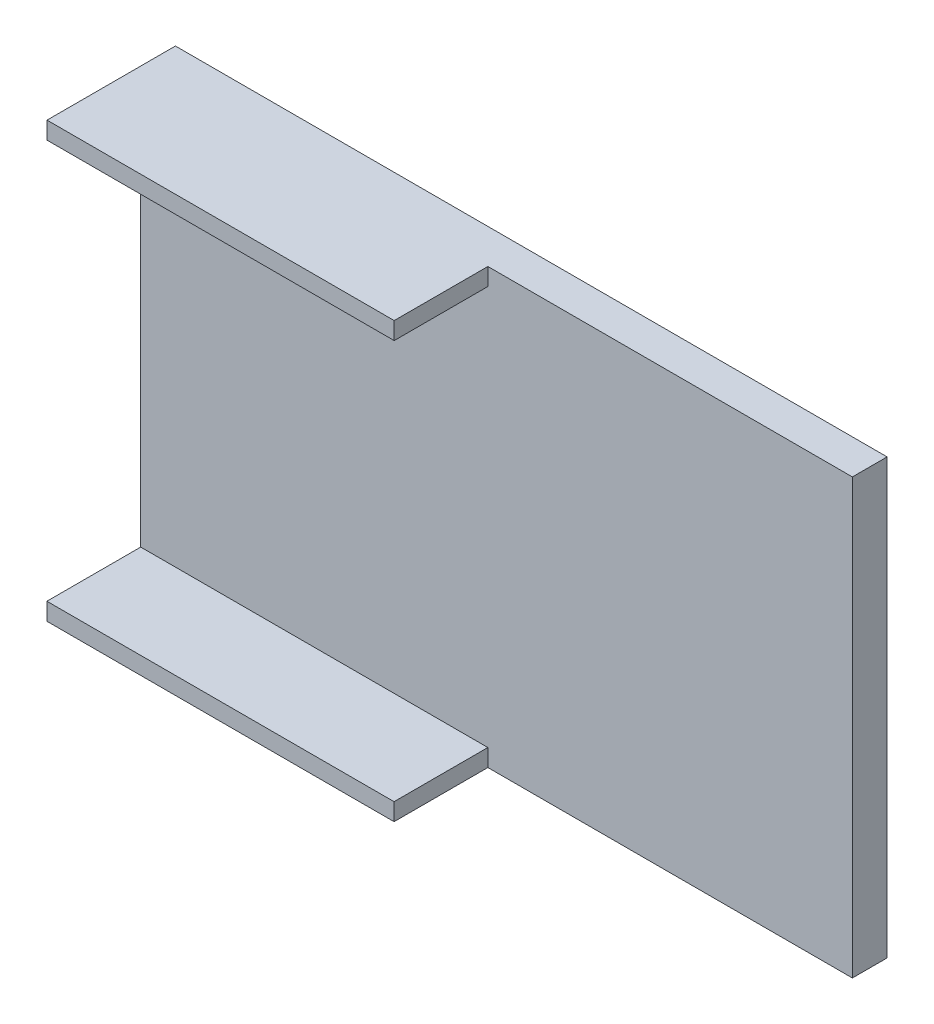
ISO-10303-21;
HEADER;
FILE_DESCRIPTION(('STEP AP214'),'2;1');
FILE_NAME('part.step','',(''),(''),'','','');
FILE_SCHEMA(('AUTOMOTIVE_DESIGN { 1 0 10303 214 1 1 1 1 }'));
ENDSEC;
DATA;
#1=APPLICATION_CONTEXT('core data for automotive mechanical design processes');
#2=APPLICATION_PROTOCOL_DEFINITION('international standard','automotive_design',2000,#1);
#3=PRODUCT_CONTEXT('',#1,'mechanical');
#4=PRODUCT('Part','Part','',(#3));
#5=PRODUCT_RELATED_PRODUCT_CATEGORY('part','',(#4));
#6=PRODUCT_DEFINITION_FORMATION('','',#4);
#7=PRODUCT_DEFINITION_CONTEXT('part definition',#1,'design');
#8=PRODUCT_DEFINITION('design','',#6,#7);
#9=PRODUCT_DEFINITION_SHAPE('','',#8);
#10=(LENGTH_UNIT() NAMED_UNIT(*) SI_UNIT(.MILLI.,.METRE.));
#11=(NAMED_UNIT(*) PLANE_ANGLE_UNIT() SI_UNIT($,.RADIAN.));
#12=(NAMED_UNIT(*) SI_UNIT($,.STERADIAN.) SOLID_ANGLE_UNIT());
#13=UNCERTAINTY_MEASURE_WITH_UNIT(LENGTH_MEASURE(1.E-05),#10,'distance_accuracy_value','');
#14=(GEOMETRIC_REPRESENTATION_CONTEXT(3) GLOBAL_UNCERTAINTY_ASSIGNED_CONTEXT((#13)) GLOBAL_UNIT_ASSIGNED_CONTEXT((#10,
#11,#12)) REPRESENTATION_CONTEXT('',''));
#15=CARTESIAN_POINT('',(0.,0.,0.));
#16=DIRECTION('',(0.,0.,1.));
#17=DIRECTION('',(1.,0.,0.));
#18=AXIS2_PLACEMENT_3D('',#15,#16,#17);
#19=CARTESIAN_POINT('',(0.,0.,7.396334009263));
#20=DIRECTION('',(0.,0.,1.));
#21=DIRECTION('',(1.,0.,0.));
#22=AXIS2_PLACEMENT_3D('',#19,#20,#21);
#23=PLANE('',#22);
#24=DIRECTION('',(0.,1.,0.));
#25=VECTOR('',#24,1.);
#26=CARTESIAN_POINT('',(20.16966207904,25.348600645856,7.396334009263));
#27=LINE('',#26,#25);
#28=CARTESIAN_POINT('',(20.16966207904,24.348600645856,7.396334009263));
#29=VERTEX_POINT('',#28);
#30=CARTESIAN_POINT('',(20.16966207904,25.348600645856,7.396334009263));
#31=VERTEX_POINT('',#30);
#32=EDGE_CURVE('E99',#29,#31,#27,.T.);
#33=ORIENTED_EDGE('',*,*,#32,.T.);
#34=DIRECTION('',(1.,0.,0.));
#35=VECTOR('',#34,1.);
#36=CARTESIAN_POINT('',(0.16966207904,25.348600645856,7.396334009263));
#37=LINE('',#36,#35);
#38=CARTESIAN_POINT('',(0.16966207904,25.348600645856,7.396334009263));
#39=VERTEX_POINT('',#38);
#40=EDGE_CURVE('E170',#39,#31,#37,.T.);
#41=ORIENTED_EDGE('',*,*,#40,.F.);
#42=DIRECTION('',(0.,1.,0.));
#43=VECTOR('',#42,1.);
#44=CARTESIAN_POINT('',(0.16966207904,0.,7.396334009263));
#45=LINE('',#44,#43);
#46=CARTESIAN_POINT('',(0.16966207904,24.348600645856,7.396334009263));
#47=VERTEX_POINT('',#46);
#48=EDGE_CURVE('E20',#39,#47,#45,.F.);
#49=ORIENTED_EDGE('',*,*,#48,.T.);
#50=DIRECTION('',(1.,0.,0.));
#51=VECTOR('',#50,1.);
#52=CARTESIAN_POINT('',(0.16966207904,24.348600645856,7.396334009263));
#53=LINE('',#52,#51);
#54=EDGE_CURVE('E97',#47,#29,#53,.T.);
#55=ORIENTED_EDGE('',*,*,#54,.T.);
#56=EDGE_LOOP('',(#33,#41,#49,#55));
#57=FACE_BOUND('',#56,.T.);
#58=ADVANCED_FACE('F17',(#57),#23,.T.);
#59=CARTESIAN_POINT('',(20.16966207904,25.348600645856,7.396334009263));
#60=DIRECTION('',(-1.,0.,0.));
#61=DIRECTION('',(0.,0.,1.));
#62=AXIS2_PLACEMENT_3D('',#59,#60,#61);
#63=PLANE('',#62);
#64=DIRECTION('',(0.,0.,1.));
#65=VECTOR('',#64,1.);
#66=CARTESIAN_POINT('',(20.16966207904,25.348600645856,2.));
#67=LINE('',#66,#65);
#68=CARTESIAN_POINT('',(20.16966207904,25.348600645856,2.));
#69=VERTEX_POINT('',#68);
#70=EDGE_CURVE('E107',#31,#69,#67,.F.);
#71=ORIENTED_EDGE('',*,*,#70,.F.);
#72=ORIENTED_EDGE('',*,*,#32,.F.);
#73=DIRECTION('',(0.,0.,1.));
#74=VECTOR('',#73,1.);
#75=CARTESIAN_POINT('',(20.16966207904,24.348600645856,7.396334009263));
#76=LINE('',#75,#74);
#77=CARTESIAN_POINT('',(20.16966207904,24.348600645856,2.));
#78=VERTEX_POINT('',#77);
#79=EDGE_CURVE('E92',#29,#78,#76,.F.);
#80=ORIENTED_EDGE('',*,*,#79,.T.);
#81=DIRECTION('',(0.,1.,0.));
#82=VECTOR('',#81,1.);
#83=CARTESIAN_POINT('',(20.16966207904,0.,2.));
#84=LINE('',#83,#82);
#85=EDGE_CURVE('E115',#78,#69,#84,.T.);
#86=ORIENTED_EDGE('',*,*,#85,.T.);
#87=EDGE_LOOP('',(#71,#72,#80,#86));
#88=FACE_BOUND('',#87,.T.);
#89=ADVANCED_FACE('F105',(#88),#63,.F.);
#90=CARTESIAN_POINT('',(0.,0.,7.403935709333));
#91=DIRECTION('',(0.,0.,-1.));
#92=DIRECTION('',(-1.,0.,0.));
#93=AXIS2_PLACEMENT_3D('',#90,#91,#92);
#94=PLANE('',#93);
#95=DIRECTION('',(1.,0.,0.));
#96=VECTOR('',#95,1.);
#97=CARTESIAN_POINT('',(0.16966207904,0.348600645856,7.403935709333));
#98=LINE('',#97,#96);
#99=CARTESIAN_POINT('',(0.169662079040001,0.348600645856,7.403935709333));
#100=VERTEX_POINT('',#99);
#101=CARTESIAN_POINT('',(20.16966207904,0.348600645856,7.403935709333));
#102=VERTEX_POINT('',#101);
#103=EDGE_CURVE('E159',#100,#102,#98,.T.);
#104=ORIENTED_EDGE('',*,*,#103,.T.);
#105=DIRECTION('',(0.,1.,0.));
#106=VECTOR('',#105,1.);
#107=CARTESIAN_POINT('',(20.16966207904,0.348600645856,7.403935709333));
#108=LINE('',#107,#106);
#109=CARTESIAN_POINT('',(20.16966207904,1.348600645856,7.403935709333));
#110=VERTEX_POINT('',#109);
#111=EDGE_CURVE('E103',#102,#110,#108,.T.);
#112=ORIENTED_EDGE('',*,*,#111,.T.);
#113=DIRECTION('',(1.,0.,0.));
#114=VECTOR('',#113,1.);
#115=CARTESIAN_POINT('',(0.16966207904,1.348600645856,7.403935709333));
#116=LINE('',#115,#114);
#117=CARTESIAN_POINT('',(0.169662079040001,1.348600645856,7.403935709333));
#118=VERTEX_POINT('',#117);
#119=EDGE_CURVE('E129',#110,#118,#116,.F.);
#120=ORIENTED_EDGE('',*,*,#119,.T.);
#121=DIRECTION('',(0.,1.,0.));
#122=VECTOR('',#121,1.);
#123=CARTESIAN_POINT('',(0.16966207904,0.,7.403935709333));
#124=LINE('',#123,#122);
#125=EDGE_CURVE('E109',#100,#118,#124,.T.);
#126=ORIENTED_EDGE('',*,*,#125,.F.);
#127=EDGE_LOOP('',(#104,#112,#120,#126));
#128=FACE_BOUND('',#127,.T.);
#129=ADVANCED_FACE('F130',(#128),#94,.F.);
#130=CARTESIAN_POINT('',(20.16966207904,0.348600645856,7.403935709333));
#131=DIRECTION('',(-1.,0.,0.));
#132=DIRECTION('',(0.,0.,1.));
#133=AXIS2_PLACEMENT_3D('',#130,#131,#132);
#134=PLANE('',#133);
#135=DIRECTION('',(0.,0.,-1.));
#136=VECTOR('',#135,1.);
#137=CARTESIAN_POINT('',(20.16966207904,1.348600645856,7.403935709333));
#138=LINE('',#137,#136);
#139=CARTESIAN_POINT('',(20.16966207904,1.348600645856,2.));
#140=VERTEX_POINT('',#139);
#141=EDGE_CURVE('E136',#140,#110,#138,.F.);
#142=ORIENTED_EDGE('',*,*,#141,.T.);
#143=ORIENTED_EDGE('',*,*,#111,.F.);
#144=DIRECTION('',(0.,0.,1.));
#145=VECTOR('',#144,1.);
#146=CARTESIAN_POINT('',(20.16966207904,0.348600645856,2.));
#147=LINE('',#146,#145);
#148=CARTESIAN_POINT('',(20.16966207904,0.348600645856,2.));
#149=VERTEX_POINT('',#148);
#150=EDGE_CURVE('E157',#102,#149,#147,.F.);
#151=ORIENTED_EDGE('',*,*,#150,.T.);
#152=DIRECTION('',(0.,1.,0.));
#153=VECTOR('',#152,1.);
#154=CARTESIAN_POINT('',(20.16966207904,0.,2.));
#155=LINE('',#154,#153);
#156=EDGE_CURVE('E174',#149,#140,#155,.T.);
#157=ORIENTED_EDGE('',*,*,#156,.T.);
#158=EDGE_LOOP('',(#142,#143,#151,#157));
#159=FACE_BOUND('',#158,.T.);
#160=ADVANCED_FACE('F258',(#159),#134,.F.);
#161=CARTESIAN_POINT('',(0.16966207904,24.348600645856,7.396334009263));
#162=DIRECTION('',(0.,1.,0.));
#163=DIRECTION('',(0.,0.,1.));
#164=AXIS2_PLACEMENT_3D('',#161,#162,#163);
#165=PLANE('',#164);
#166=ORIENTED_EDGE('',*,*,#79,.F.);
#167=ORIENTED_EDGE('',*,*,#54,.F.);
#168=DIRECTION('',(0.,0.,1.));
#169=VECTOR('',#168,1.);
#170=CARTESIAN_POINT('',(0.16966207904,24.348600645856,2.));
#171=LINE('',#170,#169);
#172=CARTESIAN_POINT('',(0.16966207904,24.348600645856,2.));
#173=VERTEX_POINT('',#172);
#174=EDGE_CURVE('E145',#47,#173,#171,.F.);
#175=ORIENTED_EDGE('',*,*,#174,.T.);
#176=DIRECTION('',(-1.,0.,0.));
#177=VECTOR('',#176,1.);
#178=CARTESIAN_POINT('',(0.,24.348600645856,2.));
#179=LINE('',#178,#177);
#180=EDGE_CURVE('E112',#173,#78,#179,.F.);
#181=ORIENTED_EDGE('',*,*,#180,.T.);
#182=EDGE_LOOP('',(#166,#167,#175,#181));
#183=FACE_BOUND('',#182,.T.);
#184=ADVANCED_FACE('F110',(#183),#165,.F.);
#185=CARTESIAN_POINT('',(0.,0.,2.));
#186=DIRECTION('',(0.,0.,-1.));
#187=DIRECTION('',(-1.,0.,0.));
#188=AXIS2_PLACEMENT_3D('',#185,#186,#187);
#189=PLANE('',#188);
#190=DIRECTION('',(1.,0.,0.));
#191=VECTOR('',#190,1.);
#192=CARTESIAN_POINT('',(0.16966207904,0.348600645856,2.));
#193=LINE('',#192,#191);
#194=CARTESIAN_POINT('',(41.16966207904,0.348600645856,2.));
#195=VERTEX_POINT('',#194);
#196=EDGE_CURVE('E155',#149,#195,#193,.T.);
#197=ORIENTED_EDGE('',*,*,#196,.T.);
#198=DIRECTION('',(0.,1.,0.));
#199=VECTOR('',#198,1.);
#200=CARTESIAN_POINT('',(41.16966207904,25.348600645856,2.));
#201=LINE('',#200,#199);
#202=CARTESIAN_POINT('',(41.16966207904,25.348600645856,2.));
#203=VERTEX_POINT('',#202);
#204=EDGE_CURVE('E161',#203,#195,#201,.F.);
#205=ORIENTED_EDGE('',*,*,#204,.F.);
#206=DIRECTION('',(1.,0.,0.));
#207=VECTOR('',#206,1.);
#208=CARTESIAN_POINT('',(0.16966207904,25.348600645856,2.));
#209=LINE('',#208,#207);
#210=EDGE_CURVE('E167',#69,#203,#209,.T.);
#211=ORIENTED_EDGE('',*,*,#210,.F.);
#212=ORIENTED_EDGE('',*,*,#85,.F.);
#213=ORIENTED_EDGE('',*,*,#180,.F.);
#214=DIRECTION('',(0.,1.,0.));
#215=VECTOR('',#214,1.);
#216=CARTESIAN_POINT('',(0.16966207904,25.348600645856,2.));
#217=LINE('',#216,#215);
#218=CARTESIAN_POINT('',(0.169662079040001,1.348600645856,2.));
#219=VERTEX_POINT('',#218);
#220=EDGE_CURVE('E141',#173,#219,#217,.F.);
#221=ORIENTED_EDGE('',*,*,#220,.T.);
#222=DIRECTION('',(1.,0.,0.));
#223=VECTOR('',#222,1.);
#224=CARTESIAN_POINT('',(0.16966207904,1.348600645856,2.));
#225=LINE('',#224,#223);
#226=EDGE_CURVE('E135',#219,#140,#225,.T.);
#227=ORIENTED_EDGE('',*,*,#226,.T.);
#228=ORIENTED_EDGE('',*,*,#156,.F.);
#229=EDGE_LOOP('',(#197,#205,#211,#212,#213,#221,#227,#228));
#230=FACE_BOUND('',#229,.T.);
#231=ADVANCED_FACE('F178',(#230),#189,.F.);
#232=CARTESIAN_POINT('',(0.16966207904,1.348600645856,7.403935709333));
#233=DIRECTION('',(0.,-1.,0.));
#234=DIRECTION('',(0.,0.,-1.));
#235=AXIS2_PLACEMENT_3D('',#232,#233,#234);
#236=PLANE('',#235);
#237=DIRECTION('',(0.,0.,1.));
#238=VECTOR('',#237,1.);
#239=CARTESIAN_POINT('',(0.169662079040003,1.348600645856,2.));
#240=LINE('',#239,#238);
#241=EDGE_CURVE('E126',#219,#118,#240,.T.);
#242=ORIENTED_EDGE('',*,*,#241,.T.);
#243=ORIENTED_EDGE('',*,*,#119,.F.);
#244=ORIENTED_EDGE('',*,*,#141,.F.);
#245=ORIENTED_EDGE('',*,*,#226,.F.);
#246=EDGE_LOOP('',(#242,#243,#244,#245));
#247=FACE_BOUND('',#246,.T.);
#248=ADVANCED_FACE('F139',(#247),#236,.F.);
#249=CARTESIAN_POINT('',(0.16966207904,25.348600645856,2.));
#250=DIRECTION('',(0.,1.,0.));
#251=DIRECTION('',(0.,0.,1.));
#252=AXIS2_PLACEMENT_3D('',#249,#250,#251);
#253=PLANE('',#252);
#254=ORIENTED_EDGE('',*,*,#210,.T.);
#255=DIRECTION('',(0.,0.,1.));
#256=VECTOR('',#255,1.);
#257=CARTESIAN_POINT('',(41.16966207904,25.348600645856,2.));
#258=LINE('',#257,#256);
#259=CARTESIAN_POINT('',(41.16966207904,25.348600645856,0.));
#260=VERTEX_POINT('',#259);
#261=EDGE_CURVE('E164',#260,#203,#258,.T.);
#262=ORIENTED_EDGE('',*,*,#261,.F.);
#263=DIRECTION('',(-1.,0.,0.));
#264=VECTOR('',#263,1.);
#265=CARTESIAN_POINT('',(0.,25.348600645856,0.));
#266=LINE('',#265,#264);
#267=CARTESIAN_POINT('',(0.16966207904,25.348600645856,0.));
#268=VERTEX_POINT('',#267);
#269=EDGE_CURVE('E143',#268,#260,#266,.F.);
#270=ORIENTED_EDGE('',*,*,#269,.F.);
#271=DIRECTION('',(0.,0.,1.));
#272=VECTOR('',#271,1.);
#273=CARTESIAN_POINT('',(0.16966207904,25.348600645856,2.));
#274=LINE('',#273,#272);
#275=EDGE_CURVE('E150',#268,#39,#274,.T.);
#276=ORIENTED_EDGE('',*,*,#275,.T.);
#277=ORIENTED_EDGE('',*,*,#40,.T.);
#278=ORIENTED_EDGE('',*,*,#70,.T.);
#279=EDGE_LOOP('',(#254,#262,#270,#276,#277,#278));
#280=FACE_BOUND('',#279,.T.);
#281=ADVANCED_FACE('F180',(#280),#253,.T.);
#282=CARTESIAN_POINT('',(41.16966207904,25.348600645856,2.));
#283=DIRECTION('',(1.,0.,0.));
#284=DIRECTION('',(0.,1.,0.));
#285=AXIS2_PLACEMENT_3D('',#282,#283,#284);
#286=PLANE('',#285);
#287=ORIENTED_EDGE('',*,*,#204,.T.);
#288=DIRECTION('',(0.,0.,1.));
#289=VECTOR('',#288,1.);
#290=CARTESIAN_POINT('',(41.16966207904,0.348600645856,2.));
#291=LINE('',#290,#289);
#292=CARTESIAN_POINT('',(41.16966207904,0.348600645856001,0.));
#293=VERTEX_POINT('',#292);
#294=EDGE_CURVE('E153',#195,#293,#291,.F.);
#295=ORIENTED_EDGE('',*,*,#294,.T.);
#296=DIRECTION('',(0.,1.,0.));
#297=VECTOR('',#296,1.);
#298=CARTESIAN_POINT('',(41.16966207904,0.,0.));
#299=LINE('',#298,#297);
#300=EDGE_CURVE('E188',#260,#293,#299,.F.);
#301=ORIENTED_EDGE('',*,*,#300,.F.);
#302=ORIENTED_EDGE('',*,*,#261,.T.);
#303=EDGE_LOOP('',(#287,#295,#301,#302));
#304=FACE_BOUND('',#303,.T.);
#305=ADVANCED_FACE('F196',(#304),#286,.T.);
#306=CARTESIAN_POINT('',(0.16966207904,0.348600645856,2.));
#307=DIRECTION('',(0.,1.,0.));
#308=DIRECTION('',(0.,0.,1.));
#309=AXIS2_PLACEMENT_3D('',#306,#307,#308);
#310=PLANE('',#309);
#311=ORIENTED_EDGE('',*,*,#294,.F.);
#312=ORIENTED_EDGE('',*,*,#196,.F.);
#313=ORIENTED_EDGE('',*,*,#150,.F.);
#314=ORIENTED_EDGE('',*,*,#103,.F.);
#315=DIRECTION('',(0.,0.,1.));
#316=VECTOR('',#315,1.);
#317=CARTESIAN_POINT('',(0.169662079040003,0.348600645856002,2.));
#318=LINE('',#317,#316);
#319=CARTESIAN_POINT('',(0.169662079040001,0.348600645856,0.));
#320=VERTEX_POINT('',#319);
#321=EDGE_CURVE('E35',#100,#320,#318,.F.);
#322=ORIENTED_EDGE('',*,*,#321,.T.);
#323=DIRECTION('',(-1.,0.,0.));
#324=VECTOR('',#323,1.);
#325=CARTESIAN_POINT('',(0.,0.348600645856,0.));
#326=LINE('',#325,#324);
#327=EDGE_CURVE('E26',#293,#320,#326,.T.);
#328=ORIENTED_EDGE('',*,*,#327,.F.);
#329=EDGE_LOOP('',(#311,#312,#313,#314,#322,#328));
#330=FACE_BOUND('',#329,.T.);
#331=ADVANCED_FACE('F192',(#330),#310,.F.);
#332=CARTESIAN_POINT('',(0.16966207904,25.348600645856,2.));
#333=DIRECTION('',(1.,0.,0.));
#334=DIRECTION('',(0.,1.,0.));
#335=AXIS2_PLACEMENT_3D('',#332,#333,#334);
#336=PLANE('',#335);
#337=ORIENTED_EDGE('',*,*,#321,.F.);
#338=ORIENTED_EDGE('',*,*,#125,.T.);
#339=ORIENTED_EDGE('',*,*,#241,.F.);
#340=ORIENTED_EDGE('',*,*,#220,.F.);
#341=ORIENTED_EDGE('',*,*,#174,.F.);
#342=ORIENTED_EDGE('',*,*,#48,.F.);
#343=ORIENTED_EDGE('',*,*,#275,.F.);
#344=DIRECTION('',(0.,1.,0.));
#345=VECTOR('',#344,1.);
#346=CARTESIAN_POINT('',(0.16966207904,0.,0.));
#347=LINE('',#346,#345);
#348=EDGE_CURVE('E11',#320,#268,#347,.T.);
#349=ORIENTED_EDGE('',*,*,#348,.F.);
#350=EDGE_LOOP('',(#337,#338,#339,#340,#341,#342,#343,#349));
#351=FACE_BOUND('',#350,.T.);
#352=ADVANCED_FACE('F123',(#351),#336,.F.);
#353=CARTESIAN_POINT('',(0.,0.,0.));
#354=DIRECTION('',(0.,0.,-1.));
#355=DIRECTION('',(-1.,0.,0.));
#356=AXIS2_PLACEMENT_3D('',#353,#354,#355);
#357=PLANE('',#356);
#358=ORIENTED_EDGE('',*,*,#327,.T.);
#359=ORIENTED_EDGE('',*,*,#348,.T.);
#360=ORIENTED_EDGE('',*,*,#269,.T.);
#361=ORIENTED_EDGE('',*,*,#300,.T.);
#362=EDGE_LOOP('',(#358,#359,#360,#361));
#363=FACE_BOUND('',#362,.T.);
#364=ADVANCED_FACE('F185',(#363),#357,.T.);
#365=CLOSED_SHELL('',(#58,#89,#129,#160,#184,#231,#248,#281,#305,#331,#352,#364));
#366=MANIFOLD_SOLID_BREP('B1',#365);
#367=ADVANCED_BREP_SHAPE_REPRESENTATION('',(#18,#366),#14);
#368=SHAPE_DEFINITION_REPRESENTATION(#9,#367);
ENDSEC;
END-ISO-10303-21;
